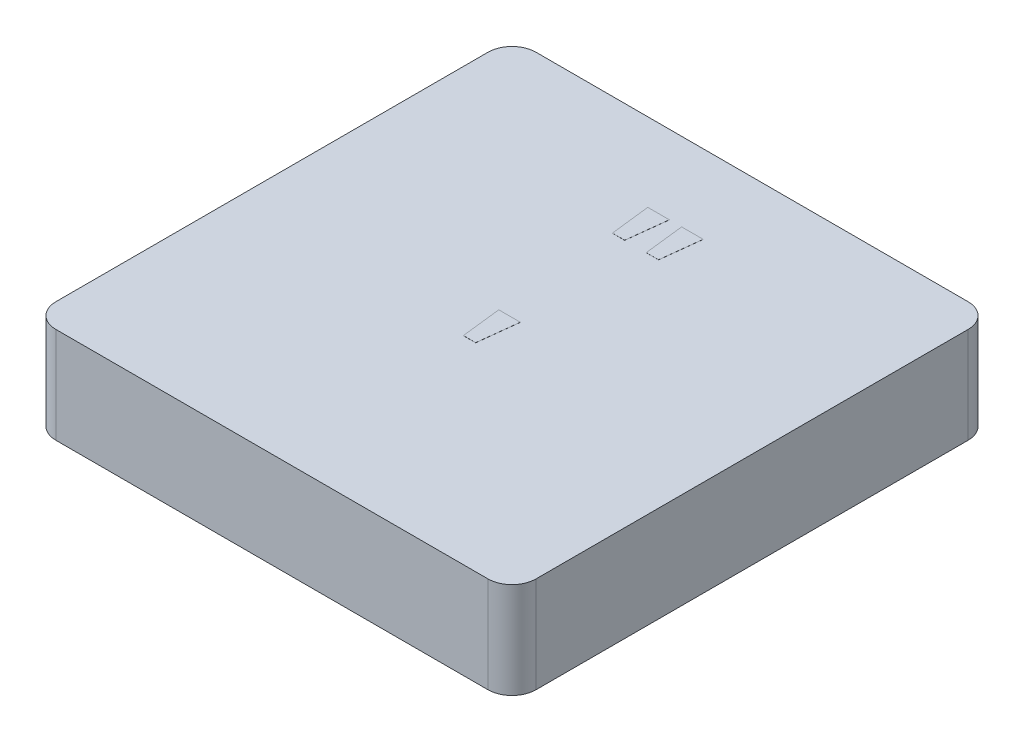
ISO-10303-21;
HEADER;
FILE_DESCRIPTION(('STEP AP214'),'2;1');
FILE_NAME('part.step','',(''),(''),'','','');
FILE_SCHEMA(('AUTOMOTIVE_DESIGN { 1 0 10303 214 1 1 1 1 }'));
ENDSEC;
DATA;
#1=APPLICATION_CONTEXT('core data for automotive mechanical design processes');
#2=APPLICATION_PROTOCOL_DEFINITION('international standard','automotive_design',2000,#1);
#3=PRODUCT_CONTEXT('',#1,'mechanical');
#4=PRODUCT('Part','Part','',(#3));
#5=PRODUCT_RELATED_PRODUCT_CATEGORY('part','',(#4));
#6=PRODUCT_DEFINITION_FORMATION('','',#4);
#7=PRODUCT_DEFINITION_CONTEXT('part definition',#1,'design');
#8=PRODUCT_DEFINITION('design','',#6,#7);
#9=PRODUCT_DEFINITION_SHAPE('','',#8);
#10=(LENGTH_UNIT() NAMED_UNIT(*) SI_UNIT(.MILLI.,.METRE.));
#11=(NAMED_UNIT(*) PLANE_ANGLE_UNIT() SI_UNIT($,.RADIAN.));
#12=(NAMED_UNIT(*) SI_UNIT($,.STERADIAN.) SOLID_ANGLE_UNIT());
#13=UNCERTAINTY_MEASURE_WITH_UNIT(LENGTH_MEASURE(1.E-05),#10,'distance_accuracy_value','');
#14=(GEOMETRIC_REPRESENTATION_CONTEXT(3) GLOBAL_UNCERTAINTY_ASSIGNED_CONTEXT((#13)) GLOBAL_UNIT_ASSIGNED_CONTEXT((#10,
#11,#12)) REPRESENTATION_CONTEXT('',''));
#15=CARTESIAN_POINT('',(0.,0.,0.));
#16=DIRECTION('',(0.,0.,1.));
#17=DIRECTION('',(1.,0.,0.));
#18=AXIS2_PLACEMENT_3D('',#15,#16,#17);
#19=CARTESIAN_POINT('',(0.,2.54,-12.7));
#20=DIRECTION('',(1.,0.,0.));
#21=DIRECTION('',(0.,0.,-1.));
#22=AXIS2_PLACEMENT_3D('',#19,#20,#21);
#23=PLANE('',#22);
#24=DIRECTION('',(0.,0.,1.));
#25=VECTOR('',#24,1.);
#26=CARTESIAN_POINT('',(0.,2.54,-12.7));
#27=LINE('',#26,#25);
#28=CARTESIAN_POINT('',(0.,2.54,-12.065));
#29=VERTEX_POINT('',#28);
#30=CARTESIAN_POINT('',(0.,2.54,-0.635));
#31=VERTEX_POINT('',#30);
#32=EDGE_CURVE('E335',#29,#31,#27,.T.);
#33=ORIENTED_EDGE('',*,*,#32,.F.);
#34=DIRECTION('',(0.,-1.,0.));
#35=VECTOR('',#34,1.);
#36=CARTESIAN_POINT('',(0.,2.54,-12.065));
#37=LINE('',#36,#35);
#38=CARTESIAN_POINT('',(0.,0.,-12.065));
#39=VERTEX_POINT('',#38);
#40=EDGE_CURVE('E360',#29,#39,#37,.T.);
#41=ORIENTED_EDGE('',*,*,#40,.T.);
#42=DIRECTION('',(0.,0.,1.));
#43=VECTOR('',#42,1.);
#44=CARTESIAN_POINT('',(0.,0.,-12.7));
#45=LINE('',#44,#43);
#46=CARTESIAN_POINT('',(0.,0.,-0.635));
#47=VERTEX_POINT('',#46);
#48=EDGE_CURVE('E315',#39,#47,#45,.T.);
#49=ORIENTED_EDGE('',*,*,#48,.T.);
#50=DIRECTION('',(0.,-1.,0.));
#51=VECTOR('',#50,1.);
#52=CARTESIAN_POINT('',(0.,2.54,-0.635));
#53=LINE('',#52,#51);
#54=EDGE_CURVE('E348',#47,#31,#53,.F.);
#55=ORIENTED_EDGE('',*,*,#54,.T.);
#56=EDGE_LOOP('',(#33,#41,#49,#55));
#57=FACE_BOUND('',#56,.T.);
#58=ADVANCED_FACE('F33',(#57),#23,.F.);
#59=CARTESIAN_POINT('',(0.,2.54,0.));
#60=DIRECTION('',(0.,0.,-1.));
#61=DIRECTION('',(-1.,0.,0.));
#62=AXIS2_PLACEMENT_3D('',#59,#60,#61);
#63=PLANE('',#62);
#64=DIRECTION('',(1.,0.,0.));
#65=VECTOR('',#64,1.);
#66=CARTESIAN_POINT('',(0.,0.,0.));
#67=LINE('',#66,#65);
#68=CARTESIAN_POINT('',(0.635,0.,0.));
#69=VERTEX_POINT('',#68);
#70=CARTESIAN_POINT('',(12.065,0.,0.));
#71=VERTEX_POINT('',#70);
#72=EDGE_CURVE('E351',#69,#71,#67,.T.);
#73=ORIENTED_EDGE('',*,*,#72,.T.);
#74=DIRECTION('',(0.,-1.,0.));
#75=VECTOR('',#74,1.);
#76=CARTESIAN_POINT('',(12.065,2.54,0.));
#77=LINE('',#76,#75);
#78=CARTESIAN_POINT('',(12.065,2.54,0.));
#79=VERTEX_POINT('',#78);
#80=EDGE_CURVE('E41',#71,#79,#77,.F.);
#81=ORIENTED_EDGE('',*,*,#80,.T.);
#82=DIRECTION('',(1.,0.,0.));
#83=VECTOR('',#82,1.);
#84=CARTESIAN_POINT('',(0.,2.54,0.));
#85=LINE('',#84,#83);
#86=CARTESIAN_POINT('',(0.635,2.54,0.));
#87=VERTEX_POINT('',#86);
#88=EDGE_CURVE('E338',#87,#79,#85,.T.);
#89=ORIENTED_EDGE('',*,*,#88,.F.);
#90=DIRECTION('',(0.,-1.,0.));
#91=VECTOR('',#90,1.);
#92=CARTESIAN_POINT('',(0.635,2.54,0.));
#93=LINE('',#92,#91);
#94=EDGE_CURVE('E389',#87,#69,#93,.T.);
#95=ORIENTED_EDGE('',*,*,#94,.T.);
#96=EDGE_LOOP('',(#73,#81,#89,#95));
#97=FACE_BOUND('',#96,.T.);
#98=ADVANCED_FACE('F394',(#97),#63,.F.);
#99=CARTESIAN_POINT('',(12.7,2.54,0.));
#100=DIRECTION('',(-1.,0.,0.));
#101=DIRECTION('',(0.,0.,1.));
#102=AXIS2_PLACEMENT_3D('',#99,#100,#101);
#103=PLANE('',#102);
#104=DIRECTION('',(0.,0.,-1.));
#105=VECTOR('',#104,1.);
#106=CARTESIAN_POINT('',(12.7,0.,0.));
#107=LINE('',#106,#105);
#108=CARTESIAN_POINT('',(12.7,0.,-0.635));
#109=VERTEX_POINT('',#108);
#110=CARTESIAN_POINT('',(12.7,0.,-12.065));
#111=VERTEX_POINT('',#110);
#112=EDGE_CURVE('E354',#109,#111,#107,.T.);
#113=ORIENTED_EDGE('',*,*,#112,.T.);
#114=DIRECTION('',(0.,-1.,0.));
#115=VECTOR('',#114,1.);
#116=CARTESIAN_POINT('',(12.7,2.54,-12.065));
#117=LINE('',#116,#115);
#118=CARTESIAN_POINT('',(12.7,2.54,-12.065));
#119=VERTEX_POINT('',#118);
#120=EDGE_CURVE('E387',#111,#119,#117,.F.);
#121=ORIENTED_EDGE('',*,*,#120,.T.);
#122=DIRECTION('',(0.,0.,-1.));
#123=VECTOR('',#122,1.);
#124=CARTESIAN_POINT('',(12.7,2.54,0.));
#125=LINE('',#124,#123);
#126=CARTESIAN_POINT('',(12.7,2.54,-0.635));
#127=VERTEX_POINT('',#126);
#128=EDGE_CURVE('E342',#127,#119,#125,.T.);
#129=ORIENTED_EDGE('',*,*,#128,.F.);
#130=DIRECTION('',(0.,-1.,0.));
#131=VECTOR('',#130,1.);
#132=CARTESIAN_POINT('',(12.7,2.54,-0.635));
#133=LINE('',#132,#131);
#134=EDGE_CURVE('E384',#127,#109,#133,.T.);
#135=ORIENTED_EDGE('',*,*,#134,.T.);
#136=EDGE_LOOP('',(#113,#121,#129,#135));
#137=FACE_BOUND('',#136,.T.);
#138=ADVANCED_FACE('F407',(#137),#103,.F.);
#139=CARTESIAN_POINT('',(12.7,2.54,-12.7));
#140=DIRECTION('',(0.,0.,1.));
#141=DIRECTION('',(1.,0.,0.));
#142=AXIS2_PLACEMENT_3D('',#139,#140,#141);
#143=PLANE('',#142);
#144=DIRECTION('',(-1.,0.,0.));
#145=VECTOR('',#144,1.);
#146=CARTESIAN_POINT('',(12.7,0.,-12.7));
#147=LINE('',#146,#145);
#148=CARTESIAN_POINT('',(12.065,0.,-12.7));
#149=VERTEX_POINT('',#148);
#150=CARTESIAN_POINT('',(0.634999999999995,0.,-12.7));
#151=VERTEX_POINT('',#150);
#152=EDGE_CURVE('E339',#149,#151,#147,.T.);
#153=ORIENTED_EDGE('',*,*,#152,.T.);
#154=DIRECTION('',(0.,-1.,0.));
#155=VECTOR('',#154,1.);
#156=CARTESIAN_POINT('',(0.634999999999995,2.54,-12.7));
#157=LINE('',#156,#155);
#158=CARTESIAN_POINT('',(0.634999999999995,2.54,-12.7));
#159=VERTEX_POINT('',#158);
#160=EDGE_CURVE('E374',#151,#159,#157,.F.);
#161=ORIENTED_EDGE('',*,*,#160,.T.);
#162=DIRECTION('',(-1.,0.,0.));
#163=VECTOR('',#162,1.);
#164=CARTESIAN_POINT('',(12.7,2.54,-12.7));
#165=LINE('',#164,#163);
#166=CARTESIAN_POINT('',(12.065,2.54,-12.7));
#167=VERTEX_POINT('',#166);
#168=EDGE_CURVE('E345',#167,#159,#165,.T.);
#169=ORIENTED_EDGE('',*,*,#168,.F.);
#170=DIRECTION('',(0.,-1.,0.));
#171=VECTOR('',#170,1.);
#172=CARTESIAN_POINT('',(12.065,2.54,-12.7));
#173=LINE('',#172,#171);
#174=EDGE_CURVE('E371',#167,#149,#173,.T.);
#175=ORIENTED_EDGE('',*,*,#174,.T.);
#176=EDGE_LOOP('',(#153,#161,#169,#175));
#177=FACE_BOUND('',#176,.T.);
#178=ADVANCED_FACE('F419',(#177),#143,.F.);
#179=CARTESIAN_POINT('',(0.,2.54,0.));
#180=DIRECTION('',(0.,1.,0.));
#181=DIRECTION('',(0.,0.,1.));
#182=AXIS2_PLACEMENT_3D('',#179,#180,#181);
#183=PLANE('',#182);
#184=DIRECTION('',(-0.114624107985131,0.,0.993408935871131));
#185=VECTOR('',#184,1.);
#186=CARTESIAN_POINT('',(6.61539743589743,2.54,-6.30441025641026));
#187=LINE('',#186,#185);
#188=CARTESIAN_POINT('',(6.61539743589743,2.54,-6.30441025641026));
#189=VERTEX_POINT('',#188);
#190=CARTESIAN_POINT('',(6.49328205128205,2.54,-5.24607692307692));
#191=VERTEX_POINT('',#190);
#192=EDGE_CURVE('E223',#189,#191,#187,.T.);
#193=ORIENTED_EDGE('',*,*,#192,.T.);
#194=DIRECTION('',(-1.,0.,0.));
#195=VECTOR('',#194,1.);
#196=CARTESIAN_POINT('',(6.49328205128205,2.54,-5.24607692307692));
#197=LINE('',#196,#195);
#198=CARTESIAN_POINT('',(6.16764102564102,2.54,-5.24607692307692));
#199=VERTEX_POINT('',#198);
#200=EDGE_CURVE('E199',#191,#199,#197,.T.);
#201=ORIENTED_EDGE('',*,*,#200,.T.);
#202=DIRECTION('',(-0.114624107985131,0.,-0.993408935871131));
#203=VECTOR('',#202,1.);
#204=CARTESIAN_POINT('',(6.16764102564102,2.54,-5.24607692307692));
#205=LINE('',#204,#203);
#206=CARTESIAN_POINT('',(6.04552564102564,2.54,-6.30441025641026));
#207=VERTEX_POINT('',#206);
#208=EDGE_CURVE('E53',#199,#207,#205,.T.);
#209=ORIENTED_EDGE('',*,*,#208,.T.);
#210=DIRECTION('',(1.,0.,0.));
#211=VECTOR('',#210,1.);
#212=CARTESIAN_POINT('',(6.04552564102564,2.54,-6.30441025641026));
#213=LINE('',#212,#211);
#214=EDGE_CURVE('E48',#207,#189,#213,.T.);
#215=ORIENTED_EDGE('',*,*,#214,.T.);
#216=EDGE_LOOP('',(#193,#201,#209,#215));
#217=FACE_BOUND('',#216,.T.);
#218=DIRECTION('',(-0.114624107985131,0.,0.993408935871131));
#219=VECTOR('',#218,1.);
#220=CARTESIAN_POINT('',(6.23928205128205,2.54,-10.6224102564103));
#221=LINE('',#220,#219);
#222=CARTESIAN_POINT('',(6.23928205128205,2.54,-10.6224102564103));
#223=VERTEX_POINT('',#222);
#224=CARTESIAN_POINT('',(6.11716666666666,2.54,-9.56407692307692));
#225=VERTEX_POINT('',#224);
#226=EDGE_CURVE('E228',#223,#225,#221,.T.);
#227=ORIENTED_EDGE('',*,*,#226,.T.);
#228=DIRECTION('',(-1.,0.,0.));
#229=VECTOR('',#228,1.);
#230=CARTESIAN_POINT('',(6.11716666666666,2.54,-9.56407692307692));
#231=LINE('',#230,#229);
#232=CARTESIAN_POINT('',(5.79152564102564,2.54,-9.56407692307692));
#233=VERTEX_POINT('',#232);
#234=EDGE_CURVE('E247',#225,#233,#231,.T.);
#235=ORIENTED_EDGE('',*,*,#234,.T.);
#236=DIRECTION('',(-0.114624107985131,0.,-0.993408935871131));
#237=VECTOR('',#236,1.);
#238=CARTESIAN_POINT('',(5.79152564102564,2.54,-9.56407692307692));
#239=LINE('',#238,#237);
#240=CARTESIAN_POINT('',(5.66941025641025,2.54,-10.6224102564103));
#241=VERTEX_POINT('',#240);
#242=EDGE_CURVE('E249',#233,#241,#239,.T.);
#243=ORIENTED_EDGE('',*,*,#242,.T.);
#244=DIRECTION('',(1.,0.,0.));
#245=VECTOR('',#244,1.);
#246=CARTESIAN_POINT('',(5.66941025641025,2.54,-10.6224102564103));
#247=LINE('',#246,#245);
#248=EDGE_CURVE('E236',#241,#223,#247,.T.);
#249=ORIENTED_EDGE('',*,*,#248,.T.);
#250=EDGE_LOOP('',(#227,#235,#243,#249));
#251=FACE_BOUND('',#250,.T.);
#252=DIRECTION('',(-0.114624107985131,0.,0.993408935871131));
#253=VECTOR('',#252,1.);
#254=CARTESIAN_POINT('',(7.13479487179487,2.54,-10.6224102564103));
#255=LINE('',#254,#253);
#256=CARTESIAN_POINT('',(7.13479487179487,2.54,-10.6224102564103));
#257=VERTEX_POINT('',#256);
#258=CARTESIAN_POINT('',(7.01267948717948,2.54,-9.56407692307692));
#259=VERTEX_POINT('',#258);
#260=EDGE_CURVE('E255',#257,#259,#255,.T.);
#261=ORIENTED_EDGE('',*,*,#260,.T.);
#262=DIRECTION('',(-1.,0.,0.));
#263=VECTOR('',#262,1.);
#264=CARTESIAN_POINT('',(7.01267948717948,2.54,-9.56407692307692));
#265=LINE('',#264,#263);
#266=CARTESIAN_POINT('',(6.68703846153846,2.54,-9.56407692307692));
#267=VERTEX_POINT('',#266);
#268=EDGE_CURVE('E279',#259,#267,#265,.T.);
#269=ORIENTED_EDGE('',*,*,#268,.T.);
#270=DIRECTION('',(-0.11462410798513,0.,-0.993408935871131));
#271=VECTOR('',#270,1.);
#272=CARTESIAN_POINT('',(6.68703846153846,2.54,-9.56407692307692));
#273=LINE('',#272,#271);
#274=CARTESIAN_POINT('',(6.56492307692307,2.54,-10.6224102564103));
#275=VERTEX_POINT('',#274);
#276=EDGE_CURVE('E281',#267,#275,#273,.T.);
#277=ORIENTED_EDGE('',*,*,#276,.T.);
#278=DIRECTION('',(1.,0.,0.));
#279=VECTOR('',#278,1.);
#280=CARTESIAN_POINT('',(6.56492307692307,2.54,-10.6224102564103));
#281=LINE('',#280,#279);
#282=EDGE_CURVE('E268',#275,#257,#281,.T.);
#283=ORIENTED_EDGE('',*,*,#282,.T.);
#284=EDGE_LOOP('',(#261,#269,#277,#283));
#285=FACE_BOUND('',#284,.T.);
#286=ORIENTED_EDGE('',*,*,#168,.T.);
#287=CARTESIAN_POINT('',(0.634999999999995,2.54,-12.065));
#288=DIRECTION('',(0.,1.,0.));
#289=DIRECTION('',(0.,0.,1.));
#290=AXIS2_PLACEMENT_3D('',#287,#288,#289);
#291=CIRCLE('',#290,0.635);
#292=EDGE_CURVE('E382',#159,#29,#291,.T.);
#293=ORIENTED_EDGE('',*,*,#292,.T.);
#294=ORIENTED_EDGE('',*,*,#32,.T.);
#295=CARTESIAN_POINT('',(0.635,2.54,-0.635));
#296=DIRECTION('',(0.,1.,0.));
#297=DIRECTION('',(0.,0.,1.));
#298=AXIS2_PLACEMENT_3D('',#295,#296,#297);
#299=CIRCLE('',#298,0.635);
#300=EDGE_CURVE('E376',#31,#87,#299,.T.);
#301=ORIENTED_EDGE('',*,*,#300,.T.);
#302=ORIENTED_EDGE('',*,*,#88,.T.);
#303=CARTESIAN_POINT('',(12.065,2.54,-0.635));
#304=DIRECTION('',(0.,1.,0.));
#305=DIRECTION('',(0.,0.,1.));
#306=AXIS2_PLACEMENT_3D('',#303,#304,#305);
#307=CIRCLE('',#306,0.635);
#308=EDGE_CURVE('E378',#79,#127,#307,.T.);
#309=ORIENTED_EDGE('',*,*,#308,.T.);
#310=ORIENTED_EDGE('',*,*,#128,.T.);
#311=CARTESIAN_POINT('',(12.065,2.54,-12.065));
#312=DIRECTION('',(0.,1.,0.));
#313=DIRECTION('',(0.,0.,1.));
#314=AXIS2_PLACEMENT_3D('',#311,#312,#313);
#315=CIRCLE('',#314,0.635);
#316=EDGE_CURVE('E380',#119,#167,#315,.T.);
#317=ORIENTED_EDGE('',*,*,#316,.T.);
#318=EDGE_LOOP('',(#286,#293,#294,#301,#302,#309,#310,#317));
#319=FACE_BOUND('',#318,.T.);
#320=ADVANCED_FACE('F400',(#217,#251,#285,#319),#183,.T.);
#321=CARTESIAN_POINT('',(0.,0.,0.));
#322=DIRECTION('',(0.,1.,0.));
#323=DIRECTION('',(0.,0.,1.));
#324=AXIS2_PLACEMENT_3D('',#321,#322,#323);
#325=PLANE('',#324);
#326=DIRECTION('',(-1.,0.,0.));
#327=VECTOR('',#326,1.);
#328=CARTESIAN_POINT('',(12.7,0.,-12.065));
#329=LINE('',#328,#327);
#330=CARTESIAN_POINT('',(12.065,0.,-12.065));
#331=VERTEX_POINT('',#330);
#332=CARTESIAN_POINT('',(0.634999999999995,0.,-12.065));
#333=VERTEX_POINT('',#332);
#334=EDGE_CURVE('E303',#331,#333,#329,.T.);
#335=ORIENTED_EDGE('',*,*,#334,.T.);
#336=DIRECTION('',(0.,0.,1.));
#337=VECTOR('',#336,1.);
#338=CARTESIAN_POINT('',(0.634999999999995,0.,-12.7));
#339=LINE('',#338,#337);
#340=CARTESIAN_POINT('',(0.635,0.,-0.635));
#341=VERTEX_POINT('',#340);
#342=EDGE_CURVE('E298',#333,#341,#339,.T.);
#343=ORIENTED_EDGE('',*,*,#342,.T.);
#344=DIRECTION('',(1.,0.,0.));
#345=VECTOR('',#344,1.);
#346=CARTESIAN_POINT('',(0.,0.,-0.635));
#347=LINE('',#346,#345);
#348=CARTESIAN_POINT('',(12.065,0.,-0.635));
#349=VERTEX_POINT('',#348);
#350=EDGE_CURVE('E327',#341,#349,#347,.T.);
#351=ORIENTED_EDGE('',*,*,#350,.T.);
#352=DIRECTION('',(0.,0.,-1.));
#353=VECTOR('',#352,1.);
#354=CARTESIAN_POINT('',(12.065,0.,0.));
#355=LINE('',#354,#353);
#356=EDGE_CURVE('E330',#349,#331,#355,.T.);
#357=ORIENTED_EDGE('',*,*,#356,.T.);
#358=EDGE_LOOP('',(#335,#343,#351,#357));
#359=FACE_BOUND('',#358,.T.);
#360=ORIENTED_EDGE('',*,*,#48,.F.);
#361=CARTESIAN_POINT('',(0.634999999999995,0.,-12.065));
#362=DIRECTION('',(0.,1.,0.));
#363=DIRECTION('',(0.,0.,1.));
#364=AXIS2_PLACEMENT_3D('',#361,#362,#363);
#365=CIRCLE('',#364,0.635);
#366=EDGE_CURVE('E369',#39,#151,#365,.F.);
#367=ORIENTED_EDGE('',*,*,#366,.T.);
#368=ORIENTED_EDGE('',*,*,#152,.F.);
#369=CARTESIAN_POINT('',(12.065,0.,-12.065));
#370=DIRECTION('',(0.,1.,0.));
#371=DIRECTION('',(0.,0.,1.));
#372=AXIS2_PLACEMENT_3D('',#369,#370,#371);
#373=CIRCLE('',#372,0.635);
#374=EDGE_CURVE('E367',#149,#111,#373,.F.);
#375=ORIENTED_EDGE('',*,*,#374,.T.);
#376=ORIENTED_EDGE('',*,*,#112,.F.);
#377=CARTESIAN_POINT('',(12.065,0.,-0.635));
#378=DIRECTION('',(0.,1.,0.));
#379=DIRECTION('',(0.,0.,1.));
#380=AXIS2_PLACEMENT_3D('',#377,#378,#379);
#381=CIRCLE('',#380,0.635);
#382=EDGE_CURVE('E365',#109,#71,#381,.F.);
#383=ORIENTED_EDGE('',*,*,#382,.T.);
#384=ORIENTED_EDGE('',*,*,#72,.F.);
#385=CARTESIAN_POINT('',(0.635,0.,-0.635));
#386=DIRECTION('',(0.,1.,0.));
#387=DIRECTION('',(0.,0.,1.));
#388=AXIS2_PLACEMENT_3D('',#385,#386,#387);
#389=CIRCLE('',#388,0.635);
#390=EDGE_CURVE('E363',#69,#47,#389,.F.);
#391=ORIENTED_EDGE('',*,*,#390,.T.);
#392=EDGE_LOOP('',(#360,#367,#368,#375,#376,#383,#384,#391));
#393=FACE_BOUND('',#392,.T.);
#394=ADVANCED_FACE('F411',(#359,#393),#325,.F.);
#395=CARTESIAN_POINT('',(0.634999999999995,2.54,-12.065));
#396=DIRECTION('',(0.,-1.,0.));
#397=DIRECTION('',(0.,0.,-1.));
#398=AXIS2_PLACEMENT_3D('',#395,#396,#397);
#399=CYLINDRICAL_SURFACE('',#398,0.635);
#400=ORIENTED_EDGE('',*,*,#292,.F.);
#401=ORIENTED_EDGE('',*,*,#160,.F.);
#402=ORIENTED_EDGE('',*,*,#366,.F.);
#403=ORIENTED_EDGE('',*,*,#40,.F.);
#404=EDGE_LOOP('',(#400,#401,#402,#403));
#405=FACE_BOUND('',#404,.T.);
#406=ADVANCED_FACE('F425',(#405),#399,.T.);
#407=CARTESIAN_POINT('',(12.065,2.54,-12.065));
#408=DIRECTION('',(0.,-1.,0.));
#409=DIRECTION('',(0.,0.,-1.));
#410=AXIS2_PLACEMENT_3D('',#407,#408,#409);
#411=CYLINDRICAL_SURFACE('',#410,0.635);
#412=ORIENTED_EDGE('',*,*,#316,.F.);
#413=ORIENTED_EDGE('',*,*,#120,.F.);
#414=ORIENTED_EDGE('',*,*,#374,.F.);
#415=ORIENTED_EDGE('',*,*,#174,.F.);
#416=EDGE_LOOP('',(#412,#413,#414,#415));
#417=FACE_BOUND('',#416,.T.);
#418=ADVANCED_FACE('F416',(#417),#411,.T.);
#419=CARTESIAN_POINT('',(12.065,2.54,-0.635));
#420=DIRECTION('',(0.,-1.,0.));
#421=DIRECTION('',(0.,0.,-1.));
#422=AXIS2_PLACEMENT_3D('',#419,#420,#421);
#423=CYLINDRICAL_SURFACE('',#422,0.635);
#424=ORIENTED_EDGE('',*,*,#308,.F.);
#425=ORIENTED_EDGE('',*,*,#80,.F.);
#426=ORIENTED_EDGE('',*,*,#382,.F.);
#427=ORIENTED_EDGE('',*,*,#134,.F.);
#428=EDGE_LOOP('',(#424,#425,#426,#427));
#429=FACE_BOUND('',#428,.T.);
#430=ADVANCED_FACE('F404',(#429),#423,.T.);
#431=CARTESIAN_POINT('',(0.635,2.54,-0.635));
#432=DIRECTION('',(0.,-1.,0.));
#433=DIRECTION('',(0.,0.,-1.));
#434=AXIS2_PLACEMENT_3D('',#431,#432,#433);
#435=CYLINDRICAL_SURFACE('',#434,0.635);
#436=ORIENTED_EDGE('',*,*,#300,.F.);
#437=ORIENTED_EDGE('',*,*,#54,.F.);
#438=ORIENTED_EDGE('',*,*,#390,.F.);
#439=ORIENTED_EDGE('',*,*,#94,.F.);
#440=EDGE_LOOP('',(#436,#437,#438,#439));
#441=FACE_BOUND('',#440,.T.);
#442=ADVANCED_FACE('F35',(#441),#435,.T.);
#443=CARTESIAN_POINT('',(0.634999999999995,2.54,-12.7));
#444=DIRECTION('',(1.,0.,0.));
#445=DIRECTION('',(0.,0.,-1.));
#446=AXIS2_PLACEMENT_3D('',#443,#444,#445);
#447=PLANE('',#446);
#448=DIRECTION('',(0.,0.,1.));
#449=VECTOR('',#448,1.);
#450=CARTESIAN_POINT('',(0.634999999999995,1.905,-12.7));
#451=LINE('',#450,#449);
#452=CARTESIAN_POINT('',(0.634999999999995,1.905,-12.065));
#453=VERTEX_POINT('',#452);
#454=CARTESIAN_POINT('',(0.635,1.905,-0.635));
#455=VERTEX_POINT('',#454);
#456=EDGE_CURVE('E299',#453,#455,#451,.T.);
#457=ORIENTED_EDGE('',*,*,#456,.T.);
#458=DIRECTION('',(0.,1.,0.));
#459=VECTOR('',#458,1.);
#460=CARTESIAN_POINT('',(0.635,2.54,-0.635));
#461=LINE('',#460,#459);
#462=EDGE_CURVE('E308',#341,#455,#461,.T.);
#463=ORIENTED_EDGE('',*,*,#462,.F.);
#464=ORIENTED_EDGE('',*,*,#342,.F.);
#465=DIRECTION('',(0.,1.,0.));
#466=VECTOR('',#465,1.);
#467=CARTESIAN_POINT('',(0.634999999999995,2.54,-12.065));
#468=LINE('',#467,#466);
#469=EDGE_CURVE('E304',#333,#453,#468,.T.);
#470=ORIENTED_EDGE('',*,*,#469,.T.);
#471=EDGE_LOOP('',(#457,#463,#464,#470));
#472=FACE_BOUND('',#471,.T.);
#473=ADVANCED_FACE('F430',(#472),#447,.T.);
#474=CARTESIAN_POINT('',(0.,2.54,-0.635));
#475=DIRECTION('',(0.,0.,-1.));
#476=DIRECTION('',(-1.,0.,0.));
#477=AXIS2_PLACEMENT_3D('',#474,#475,#476);
#478=PLANE('',#477);
#479=ORIENTED_EDGE('',*,*,#350,.F.);
#480=ORIENTED_EDGE('',*,*,#462,.T.);
#481=DIRECTION('',(1.,0.,0.));
#482=VECTOR('',#481,1.);
#483=CARTESIAN_POINT('',(0.,1.905,-0.635));
#484=LINE('',#483,#482);
#485=CARTESIAN_POINT('',(12.065,1.905,-0.635));
#486=VERTEX_POINT('',#485);
#487=EDGE_CURVE('E302',#455,#486,#484,.T.);
#488=ORIENTED_EDGE('',*,*,#487,.T.);
#489=DIRECTION('',(0.,1.,0.));
#490=VECTOR('',#489,1.);
#491=CARTESIAN_POINT('',(12.065,2.54,-0.635));
#492=LINE('',#491,#490);
#493=EDGE_CURVE('E312',#349,#486,#492,.T.);
#494=ORIENTED_EDGE('',*,*,#493,.F.);
#495=EDGE_LOOP('',(#479,#480,#488,#494));
#496=FACE_BOUND('',#495,.T.);
#497=ADVANCED_FACE('F435',(#496),#478,.T.);
#498=CARTESIAN_POINT('',(12.065,2.54,0.));
#499=DIRECTION('',(-1.,0.,0.));
#500=DIRECTION('',(0.,0.,1.));
#501=AXIS2_PLACEMENT_3D('',#498,#499,#500);
#502=PLANE('',#501);
#503=ORIENTED_EDGE('',*,*,#356,.F.);
#504=ORIENTED_EDGE('',*,*,#493,.T.);
#505=DIRECTION('',(0.,0.,-1.));
#506=VECTOR('',#505,1.);
#507=CARTESIAN_POINT('',(12.065,1.905,0.));
#508=LINE('',#507,#506);
#509=CARTESIAN_POINT('',(12.065,1.905,-12.065));
#510=VERTEX_POINT('',#509);
#511=EDGE_CURVE('E318',#486,#510,#508,.T.);
#512=ORIENTED_EDGE('',*,*,#511,.T.);
#513=DIRECTION('',(0.,1.,0.));
#514=VECTOR('',#513,1.);
#515=CARTESIAN_POINT('',(12.065,2.54,-12.065));
#516=LINE('',#515,#514);
#517=EDGE_CURVE('E307',#331,#510,#516,.T.);
#518=ORIENTED_EDGE('',*,*,#517,.F.);
#519=EDGE_LOOP('',(#503,#504,#512,#518));
#520=FACE_BOUND('',#519,.T.);
#521=ADVANCED_FACE('F488',(#520),#502,.T.);
#522=CARTESIAN_POINT('',(12.7,2.54,-12.065));
#523=DIRECTION('',(0.,0.,1.));
#524=DIRECTION('',(1.,0.,0.));
#525=AXIS2_PLACEMENT_3D('',#522,#523,#524);
#526=PLANE('',#525);
#527=ORIENTED_EDGE('',*,*,#334,.F.);
#528=ORIENTED_EDGE('',*,*,#517,.T.);
#529=DIRECTION('',(-1.,0.,0.));
#530=VECTOR('',#529,1.);
#531=CARTESIAN_POINT('',(12.7,1.905,-12.065));
#532=LINE('',#531,#530);
#533=EDGE_CURVE('E311',#510,#453,#532,.T.);
#534=ORIENTED_EDGE('',*,*,#533,.T.);
#535=ORIENTED_EDGE('',*,*,#469,.F.);
#536=EDGE_LOOP('',(#527,#528,#534,#535));
#537=FACE_BOUND('',#536,.T.);
#538=ADVANCED_FACE('F498',(#537),#526,.T.);
#539=CARTESIAN_POINT('',(0.,1.905,0.));
#540=DIRECTION('',(0.,1.,0.));
#541=DIRECTION('',(0.,0.,1.));
#542=AXIS2_PLACEMENT_3D('',#539,#540,#541);
#543=PLANE('',#542);
#544=CARTESIAN_POINT('',(6.34999999999999,1.905,-6.35));
#545=DIRECTION('',(0.,1.,0.));
#546=DIRECTION('',(0.,0.,1.));
#547=AXIS2_PLACEMENT_3D('',#544,#545,#546);
#548=CIRCLE('',#547,2.54);
#549=CARTESIAN_POINT('',(6.34999999999999,1.905,-3.81));
#550=VERTEX_POINT('',#549);
#551=EDGE_CURVE('E11',#550,#550,#548,.F.);
#552=ORIENTED_EDGE('',*,*,#551,.F.);
#553=EDGE_LOOP('',(#552));
#554=FACE_BOUND('',#553,.T.);
#555=ORIENTED_EDGE('',*,*,#533,.F.);
#556=ORIENTED_EDGE('',*,*,#511,.F.);
#557=ORIENTED_EDGE('',*,*,#487,.F.);
#558=ORIENTED_EDGE('',*,*,#456,.F.);
#559=EDGE_LOOP('',(#555,#556,#557,#558));
#560=FACE_BOUND('',#559,.T.);
#561=ADVANCED_FACE('F508',(#554,#560),#543,.F.);
#562=CARTESIAN_POINT('',(6.34999999999999,-7.18420489685532,-6.35));
#563=DIRECTION('',(0.,1.,0.));
#564=DIRECTION('',(0.,0.,1.));
#565=AXIS2_PLACEMENT_3D('',#562,#563,#564);
#566=CYLINDRICAL_SURFACE('',#565,2.54);
#567=CARTESIAN_POINT('',(6.34999999999999,0.,-6.35));
#568=DIRECTION('',(0.,1.,0.));
#569=DIRECTION('',(0.,0.,1.));
#570=AXIS2_PLACEMENT_3D('',#567,#568,#569);
#571=CIRCLE('',#570,2.54);
#572=CARTESIAN_POINT('',(6.34999999999999,0.,-3.81));
#573=VERTEX_POINT('',#572);
#574=EDGE_CURVE('E287',#573,#573,#571,.T.);
#575=CARTESIAN_POINT('',(6.34999999999999,0.,-3.81));
#576=CARTESIAN_POINT('',(6.34999999999999,0.0198437499999991,-3.81));
#577=CARTESIAN_POINT('',(6.34999999999999,0.0396874999999989,-3.81));
#578=CARTESIAN_POINT('',(6.34999999999999,0.079374999999999,-3.81));
#579=CARTESIAN_POINT('',(6.34999999999999,0.0992187499999992,-3.81));
#580=CARTESIAN_POINT('',(6.34999999999999,0.138906249999999,-3.81));
#581=CARTESIAN_POINT('',(6.34999999999999,0.158749999999999,-3.81));
#582=CARTESIAN_POINT('',(6.34999999999999,0.198437499999999,-3.81));
#583=CARTESIAN_POINT('',(6.34999999999999,0.218281249999999,-3.81));
#584=CARTESIAN_POINT('',(6.34999999999999,0.25796875,-3.81));
#585=CARTESIAN_POINT('',(6.34999999999999,0.277812499999999,-3.81));
#586=CARTESIAN_POINT('',(6.34999999999999,0.317499999999999,-3.81));
#587=CARTESIAN_POINT('',(6.34999999999999,0.337343749999999,-3.81));
#588=CARTESIAN_POINT('',(6.34999999999999,0.377031249999999,-3.81));
#589=CARTESIAN_POINT('',(6.34999999999999,0.396874999999999,-3.81));
#590=CARTESIAN_POINT('',(6.34999999999999,0.436562499999999,-3.81));
#591=CARTESIAN_POINT('',(6.34999999999999,0.456406249999999,-3.81));
#592=CARTESIAN_POINT('',(6.34999999999999,0.496093749999999,-3.81));
#593=CARTESIAN_POINT('',(6.34999999999999,0.515937499999999,-3.81));
#594=CARTESIAN_POINT('',(6.34999999999999,0.555624999999999,-3.81));
#595=CARTESIAN_POINT('',(6.34999999999999,0.575468749999999,-3.81));
#596=CARTESIAN_POINT('',(6.34999999999999,0.615156249999999,-3.81));
#597=CARTESIAN_POINT('',(6.34999999999999,0.634999999999999,-3.81));
#598=CARTESIAN_POINT('',(6.34999999999999,0.674687499999998,-3.81));
#599=CARTESIAN_POINT('',(6.34999999999999,0.694531249999998,-3.81));
#600=CARTESIAN_POINT('',(6.34999999999999,0.734218749999998,-3.81));
#601=CARTESIAN_POINT('',(6.34999999999999,0.754062499999998,-3.81));
#602=CARTESIAN_POINT('',(6.34999999999999,0.793749999999998,-3.81));
#603=CARTESIAN_POINT('',(6.34999999999999,0.813593749999999,-3.81));
#604=CARTESIAN_POINT('',(6.34999999999999,0.853281249999999,-3.81));
#605=CARTESIAN_POINT('',(6.34999999999999,0.873124999999999,-3.81));
#606=CARTESIAN_POINT('',(6.34999999999999,0.912812499999999,-3.81));
#607=CARTESIAN_POINT('',(6.34999999999999,0.932656249999999,-3.81));
#608=CARTESIAN_POINT('',(6.34999999999999,0.972343749999998,-3.81));
#609=CARTESIAN_POINT('',(6.34999999999999,0.992187499999998,-3.81));
#610=CARTESIAN_POINT('',(6.34999999999999,1.031875,-3.81));
#611=CARTESIAN_POINT('',(6.34999999999999,1.05171875,-3.81));
#612=CARTESIAN_POINT('',(6.34999999999999,1.09140625,-3.81));
#613=CARTESIAN_POINT('',(6.34999999999999,1.11125,-3.81));
#614=CARTESIAN_POINT('',(6.34999999999999,1.1509375,-3.81));
#615=CARTESIAN_POINT('',(6.34999999999999,1.17078125,-3.81));
#616=CARTESIAN_POINT('',(6.34999999999999,1.21046875,-3.81));
#617=CARTESIAN_POINT('',(6.34999999999999,1.2303125,-3.81));
#618=CARTESIAN_POINT('',(6.34999999999999,1.27,-3.81));
#619=CARTESIAN_POINT('',(6.34999999999999,1.28984375,-3.81));
#620=CARTESIAN_POINT('',(6.34999999999999,1.32953125,-3.81));
#621=CARTESIAN_POINT('',(6.34999999999999,1.349375,-3.81));
#622=CARTESIAN_POINT('',(6.34999999999999,1.3890625,-3.81));
#623=CARTESIAN_POINT('',(6.34999999999999,1.40890625,-3.81));
#624=CARTESIAN_POINT('',(6.34999999999999,1.44859375,-3.81));
#625=CARTESIAN_POINT('',(6.34999999999999,1.4684375,-3.81));
#626=CARTESIAN_POINT('',(6.34999999999999,1.508125,-3.81));
#627=CARTESIAN_POINT('',(6.34999999999999,1.52796875,-3.81));
#628=CARTESIAN_POINT('',(6.34999999999999,1.56765625,-3.81));
#629=CARTESIAN_POINT('',(6.34999999999999,1.5875,-3.81));
#630=CARTESIAN_POINT('',(6.34999999999999,1.6271875,-3.81));
#631=CARTESIAN_POINT('',(6.34999999999999,1.64703125,-3.81));
#632=CARTESIAN_POINT('',(6.34999999999999,1.68671875,-3.81));
#633=CARTESIAN_POINT('',(6.34999999999999,1.7065625,-3.81));
#634=CARTESIAN_POINT('',(6.34999999999999,1.74625,-3.81));
#635=CARTESIAN_POINT('',(6.34999999999999,1.76609375,-3.81));
#636=CARTESIAN_POINT('',(6.34999999999999,1.80578125,-3.81));
#637=CARTESIAN_POINT('',(6.34999999999999,1.825625,-3.81));
#638=CARTESIAN_POINT('',(6.34999999999999,1.8653125,-3.81));
#639=CARTESIAN_POINT('',(6.34999999999999,1.88515625,-3.81));
#640=CARTESIAN_POINT('',(6.34999999999999,1.905,-3.81));
#641=B_SPLINE_CURVE_WITH_KNOTS('',3,(#575,#576,#577,#578,#579,#580,#581,#582,#583,#584,#585,
#586,#587,#588,#589,#590,#591,#592,#593,#594,#595,#596,#597,#598,#599,#600,#601,#602,#603,#604,
#605,#606,#607,#608,#609,#610,#611,#612,#613,#614,#615,#616,#617,#618,#619,#620,#621,#622,#623,
#624,#625,#626,#627,#628,#629,#630,#631,#632,#633,#634,#635,#636,#637,#638,#639,#640),
.UNSPECIFIED.,.F.,.F.,(4,2,2,2,2,2,2,2,2,2,2,2,2,2,2,2,2,2,2,2,2,2,2,2,2,2,2,2,2,2,2,2,4),(0.,
0.0595312499999997,0.1190625,0.17859375,0.238125,0.29765625,0.3571875,0.41671875,0.47625,
0.53578125,0.5953125,0.654843749999999,0.714374999999999,0.773906249999999,0.8334375,0.89296875,
0.952499999999999,1.01203125,1.0715625,1.13109375,1.190625,1.25015625,1.3096875,1.36921875,
1.42875,1.48828125,1.5478125,1.60734375,1.666875,1.72640625,1.7859375,1.84546875,1.905),.UNSPECIFIED.);
#642=EDGE_CURVE('BSEAM518',#573,#550,#641,.T.);
#643=ORIENTED_EDGE('',*,*,#574,.T.);
#644=ORIENTED_EDGE('',*,*,#551,.T.);
#645=ORIENTED_EDGE('',*,*,#642,.T.);
#646=ORIENTED_EDGE('',*,*,#642,.F.);
#647=EDGE_LOOP('',(#643,#645,#644,#646));
#648=FACE_BOUND('',#647,.T.);
#649=ADVANCED_FACE('F518',(#648),#566,.T.);
#650=CARTESIAN_POINT('',(0.,0.,0.));
#651=DIRECTION('',(0.,1.,0.));
#652=DIRECTION('',(0.,0.,1.));
#653=AXIS2_PLACEMENT_3D('',#650,#651,#652);
#654=PLANE('',#653);
#655=ORIENTED_EDGE('',*,*,#574,.F.);
#656=EDGE_LOOP('',(#655));
#657=FACE_BOUND('',#656,.T.);
#658=ADVANCED_FACE('F528',(#657),#654,.F.);
#659=CARTESIAN_POINT('',(7.13479487179487,2.54254,-10.6224102564103));
#660=DIRECTION('',(0.993408935871131,0.,0.114624107985131));
#661=DIRECTION('',(0.114624107985131,0.,-0.993408935871131));
#662=AXIS2_PLACEMENT_3D('',#659,#660,#661);
#663=PLANE('',#662);
#664=ORIENTED_EDGE('',*,*,#260,.F.);
#665=DIRECTION('',(0.,-1.,0.));
#666=VECTOR('',#665,1.);
#667=CARTESIAN_POINT('',(7.13479487179487,2.54254,-10.6224102564103));
#668=LINE('',#667,#666);
#669=CARTESIAN_POINT('',(7.13479487179487,2.54254,-10.6224102564103));
#670=VERTEX_POINT('',#669);
#671=EDGE_CURVE('E284',#670,#257,#668,.T.);
#672=ORIENTED_EDGE('',*,*,#671,.F.);
#673=DIRECTION('',(-0.114624107985131,0.,0.993408935871131));
#674=VECTOR('',#673,1.);
#675=CARTESIAN_POINT('',(7.13479487179487,2.54254,-10.6224102564103));
#676=LINE('',#675,#674);
#677=CARTESIAN_POINT('',(7.01267948717948,2.54254,-9.56407692307692));
#678=VERTEX_POINT('',#677);
#679=EDGE_CURVE('E264',#670,#678,#676,.T.);
#680=ORIENTED_EDGE('',*,*,#679,.T.);
#681=DIRECTION('',(0.,-1.,0.));
#682=VECTOR('',#681,1.);
#683=CARTESIAN_POINT('',(7.01267948717948,2.54254,-9.56407692307692));
#684=LINE('',#683,#682);
#685=EDGE_CURVE('E277',#678,#259,#684,.T.);
#686=ORIENTED_EDGE('',*,*,#685,.T.);
#687=EDGE_LOOP('',(#664,#672,#680,#686));
#688=FACE_BOUND('',#687,.T.);
#689=ADVANCED_FACE('F538',(#688),#663,.T.);
#690=CARTESIAN_POINT('',(6.56492307692307,2.54254,-10.6224102564103));
#691=DIRECTION('',(0.,0.,-1.));
#692=DIRECTION('',(-1.,0.,0.));
#693=AXIS2_PLACEMENT_3D('',#690,#691,#692);
#694=PLANE('',#693);
#695=ORIENTED_EDGE('',*,*,#282,.F.);
#696=DIRECTION('',(0.,-1.,0.));
#697=VECTOR('',#696,1.);
#698=CARTESIAN_POINT('',(6.56492307692307,2.54254,-10.6224102564103));
#699=LINE('',#698,#697);
#700=CARTESIAN_POINT('',(6.56492307692307,2.54254,-10.6224102564103));
#701=VERTEX_POINT('',#700);
#702=EDGE_CURVE('E288',#701,#275,#699,.T.);
#703=ORIENTED_EDGE('',*,*,#702,.F.);
#704=DIRECTION('',(1.,0.,0.));
#705=VECTOR('',#704,1.);
#706=CARTESIAN_POINT('',(6.56492307692307,2.54254,-10.6224102564103));
#707=LINE('',#706,#705);
#708=EDGE_CURVE('E274',#701,#670,#707,.T.);
#709=ORIENTED_EDGE('',*,*,#708,.T.);
#710=ORIENTED_EDGE('',*,*,#671,.T.);
#711=EDGE_LOOP('',(#695,#703,#709,#710));
#712=FACE_BOUND('',#711,.T.);
#713=ADVANCED_FACE('F556',(#712),#694,.T.);
#714=CARTESIAN_POINT('',(6.68703846153846,2.54254,-9.56407692307692));
#715=DIRECTION('',(-0.993408935871131,0.,0.11462410798513));
#716=DIRECTION('',(0.11462410798513,0.,0.993408935871131));
#717=AXIS2_PLACEMENT_3D('',#714,#715,#716);
#718=PLANE('',#717);
#719=ORIENTED_EDGE('',*,*,#276,.F.);
#720=DIRECTION('',(0.,-1.,0.));
#721=VECTOR('',#720,1.);
#722=CARTESIAN_POINT('',(6.68703846153846,2.54254,-9.56407692307692));
#723=LINE('',#722,#721);
#724=CARTESIAN_POINT('',(6.68703846153846,2.54254,-9.56407692307692));
#725=VERTEX_POINT('',#724);
#726=EDGE_CURVE('E291',#725,#267,#723,.T.);
#727=ORIENTED_EDGE('',*,*,#726,.F.);
#728=DIRECTION('',(-0.11462410798513,0.,-0.993408935871131));
#729=VECTOR('',#728,1.);
#730=CARTESIAN_POINT('',(6.68703846153846,2.54254,-9.56407692307692));
#731=LINE('',#730,#729);
#732=EDGE_CURVE('E271',#725,#701,#731,.T.);
#733=ORIENTED_EDGE('',*,*,#732,.T.);
#734=ORIENTED_EDGE('',*,*,#702,.T.);
#735=EDGE_LOOP('',(#719,#727,#733,#734));
#736=FACE_BOUND('',#735,.T.);
#737=ADVANCED_FACE('F566',(#736),#718,.T.);
#738=CARTESIAN_POINT('',(7.01267948717948,2.54254,-9.56407692307692));
#739=DIRECTION('',(0.,0.,1.));
#740=DIRECTION('',(1.,0.,0.));
#741=AXIS2_PLACEMENT_3D('',#738,#739,#740);
#742=PLANE('',#741);
#743=ORIENTED_EDGE('',*,*,#268,.F.);
#744=ORIENTED_EDGE('',*,*,#685,.F.);
#745=DIRECTION('',(-1.,0.,0.));
#746=VECTOR('',#745,1.);
#747=CARTESIAN_POINT('',(7.01267948717948,2.54254,-9.56407692307692));
#748=LINE('',#747,#746);
#749=EDGE_CURVE('E267',#678,#725,#748,.T.);
#750=ORIENTED_EDGE('',*,*,#749,.T.);
#751=ORIENTED_EDGE('',*,*,#726,.T.);
#752=EDGE_LOOP('',(#743,#744,#750,#751));
#753=FACE_BOUND('',#752,.T.);
#754=ADVANCED_FACE('F576',(#753),#742,.T.);
#755=CARTESIAN_POINT('',(0.,2.54254,0.));
#756=DIRECTION('',(0.,-1.,0.));
#757=DIRECTION('',(0.,0.,-1.));
#758=AXIS2_PLACEMENT_3D('',#755,#756,#757);
#759=PLANE('',#758);
#760=ORIENTED_EDGE('',*,*,#679,.F.);
#761=ORIENTED_EDGE('',*,*,#708,.F.);
#762=ORIENTED_EDGE('',*,*,#732,.F.);
#763=ORIENTED_EDGE('',*,*,#749,.F.);
#764=EDGE_LOOP('',(#760,#761,#762,#763));
#765=FACE_BOUND('',#764,.T.);
#766=ADVANCED_FACE('F586',(#765),#759,.F.);
#767=CARTESIAN_POINT('',(6.23928205128205,2.54254,-10.6224102564103));
#768=DIRECTION('',(0.993408935871131,0.,0.114624107985131));
#769=DIRECTION('',(0.114624107985131,0.,-0.993408935871131));
#770=AXIS2_PLACEMENT_3D('',#767,#768,#769);
#771=PLANE('',#770);
#772=ORIENTED_EDGE('',*,*,#226,.F.);
#773=DIRECTION('',(0.,-1.,0.));
#774=VECTOR('',#773,1.);
#775=CARTESIAN_POINT('',(6.23928205128205,2.54254,-10.6224102564103));
#776=LINE('',#775,#774);
#777=CARTESIAN_POINT('',(6.23928205128205,2.54254,-10.6224102564103));
#778=VERTEX_POINT('',#777);
#779=EDGE_CURVE('E252',#778,#223,#776,.T.);
#780=ORIENTED_EDGE('',*,*,#779,.F.);
#781=DIRECTION('',(-0.114624107985131,0.,0.993408935871131));
#782=VECTOR('',#781,1.);
#783=CARTESIAN_POINT('',(6.23928205128205,2.54254,-10.6224102564103));
#784=LINE('',#783,#782);
#785=CARTESIAN_POINT('',(6.11716666666666,2.54254,-9.56407692307692));
#786=VERTEX_POINT('',#785);
#787=EDGE_CURVE('E232',#778,#786,#784,.T.);
#788=ORIENTED_EDGE('',*,*,#787,.T.);
#789=DIRECTION('',(0.,-1.,0.));
#790=VECTOR('',#789,1.);
#791=CARTESIAN_POINT('',(6.11716666666666,2.54254,-9.56407692307692));
#792=LINE('',#791,#790);
#793=EDGE_CURVE('E245',#786,#225,#792,.T.);
#794=ORIENTED_EDGE('',*,*,#793,.T.);
#795=EDGE_LOOP('',(#772,#780,#788,#794));
#796=FACE_BOUND('',#795,.T.);
#797=ADVANCED_FACE('F596',(#796),#771,.T.);
#798=CARTESIAN_POINT('',(5.66941025641025,2.54254,-10.6224102564103));
#799=DIRECTION('',(0.,0.,-1.));
#800=DIRECTION('',(-1.,0.,0.));
#801=AXIS2_PLACEMENT_3D('',#798,#799,#800);
#802=PLANE('',#801);
#803=ORIENTED_EDGE('',*,*,#248,.F.);
#804=DIRECTION('',(0.,-1.,0.));
#805=VECTOR('',#804,1.);
#806=CARTESIAN_POINT('',(5.66941025641025,2.54254,-10.6224102564103));
#807=LINE('',#806,#805);
#808=CARTESIAN_POINT('',(5.66941025641025,2.54254,-10.6224102564103));
#809=VERTEX_POINT('',#808);
#810=EDGE_CURVE('E256',#809,#241,#807,.T.);
#811=ORIENTED_EDGE('',*,*,#810,.F.);
#812=DIRECTION('',(1.,0.,0.));
#813=VECTOR('',#812,1.);
#814=CARTESIAN_POINT('',(5.66941025641025,2.54254,-10.6224102564103));
#815=LINE('',#814,#813);
#816=EDGE_CURVE('E242',#809,#778,#815,.T.);
#817=ORIENTED_EDGE('',*,*,#816,.T.);
#818=ORIENTED_EDGE('',*,*,#779,.T.);
#819=EDGE_LOOP('',(#803,#811,#817,#818));
#820=FACE_BOUND('',#819,.T.);
#821=ADVANCED_FACE('F606',(#820),#802,.T.);
#822=CARTESIAN_POINT('',(5.79152564102564,2.54254,-9.56407692307692));
#823=DIRECTION('',(-0.993408935871131,0.,0.114624107985131));
#824=DIRECTION('',(0.114624107985131,0.,0.993408935871131));
#825=AXIS2_PLACEMENT_3D('',#822,#823,#824);
#826=PLANE('',#825);
#827=ORIENTED_EDGE('',*,*,#242,.F.);
#828=DIRECTION('',(0.,-1.,0.));
#829=VECTOR('',#828,1.);
#830=CARTESIAN_POINT('',(5.79152564102564,2.54254,-9.56407692307692));
#831=LINE('',#830,#829);
#832=CARTESIAN_POINT('',(5.79152564102564,2.54254,-9.56407692307692));
#833=VERTEX_POINT('',#832);
#834=EDGE_CURVE('E259',#833,#233,#831,.T.);
#835=ORIENTED_EDGE('',*,*,#834,.F.);
#836=DIRECTION('',(-0.114624107985131,0.,-0.993408935871131));
#837=VECTOR('',#836,1.);
#838=CARTESIAN_POINT('',(5.79152564102564,2.54254,-9.56407692307692));
#839=LINE('',#838,#837);
#840=EDGE_CURVE('E239',#833,#809,#839,.T.);
#841=ORIENTED_EDGE('',*,*,#840,.T.);
#842=ORIENTED_EDGE('',*,*,#810,.T.);
#843=EDGE_LOOP('',(#827,#835,#841,#842));
#844=FACE_BOUND('',#843,.T.);
#845=ADVANCED_FACE('F616',(#844),#826,.T.);
#846=CARTESIAN_POINT('',(6.11716666666666,2.54254,-9.56407692307692));
#847=DIRECTION('',(0.,0.,1.));
#848=DIRECTION('',(1.,0.,0.));
#849=AXIS2_PLACEMENT_3D('',#846,#847,#848);
#850=PLANE('',#849);
#851=ORIENTED_EDGE('',*,*,#234,.F.);
#852=ORIENTED_EDGE('',*,*,#793,.F.);
#853=DIRECTION('',(-1.,0.,0.));
#854=VECTOR('',#853,1.);
#855=CARTESIAN_POINT('',(6.11716666666666,2.54254,-9.56407692307692));
#856=LINE('',#855,#854);
#857=EDGE_CURVE('E235',#786,#833,#856,.T.);
#858=ORIENTED_EDGE('',*,*,#857,.T.);
#859=ORIENTED_EDGE('',*,*,#834,.T.);
#860=EDGE_LOOP('',(#851,#852,#858,#859));
#861=FACE_BOUND('',#860,.T.);
#862=ADVANCED_FACE('F626',(#861),#850,.T.);
#863=CARTESIAN_POINT('',(0.,2.54254,0.));
#864=DIRECTION('',(0.,-1.,0.));
#865=DIRECTION('',(0.,0.,-1.));
#866=AXIS2_PLACEMENT_3D('',#863,#864,#865);
#867=PLANE('',#866);
#868=ORIENTED_EDGE('',*,*,#787,.F.);
#869=ORIENTED_EDGE('',*,*,#816,.F.);
#870=ORIENTED_EDGE('',*,*,#840,.F.);
#871=ORIENTED_EDGE('',*,*,#857,.F.);
#872=EDGE_LOOP('',(#868,#869,#870,#871));
#873=FACE_BOUND('',#872,.T.);
#874=ADVANCED_FACE('F636',(#873),#867,.F.);
#875=CARTESIAN_POINT('',(6.61539743589743,2.54254,-6.30441025641026));
#876=DIRECTION('',(0.993408935871131,0.,0.114624107985131));
#877=DIRECTION('',(0.114624107985131,0.,-0.993408935871131));
#878=AXIS2_PLACEMENT_3D('',#875,#876,#877);
#879=PLANE('',#878);
#880=ORIENTED_EDGE('',*,*,#192,.F.);
#881=DIRECTION('',(0.,-1.,0.));
#882=VECTOR('',#881,1.);
#883=CARTESIAN_POINT('',(6.61539743589743,2.54254,-6.30441025641026));
#884=LINE('',#883,#882);
#885=CARTESIAN_POINT('',(6.61539743589743,2.54254,-6.30441025641026));
#886=VERTEX_POINT('',#885);
#887=EDGE_CURVE('E217',#886,#189,#884,.T.);
#888=ORIENTED_EDGE('',*,*,#887,.F.);
#889=DIRECTION('',(-0.114624107985131,0.,0.993408935871131));
#890=VECTOR('',#889,1.);
#891=CARTESIAN_POINT('',(6.61539743589743,2.54254,-6.30441025641026));
#892=LINE('',#891,#890);
#893=CARTESIAN_POINT('',(6.49328205128205,2.54254,-5.24607692307692));
#894=VERTEX_POINT('',#893);
#895=EDGE_CURVE('E211',#886,#894,#892,.T.);
#896=ORIENTED_EDGE('',*,*,#895,.T.);
#897=DIRECTION('',(0.,-1.,0.));
#898=VECTOR('',#897,1.);
#899=CARTESIAN_POINT('',(6.49328205128205,2.54254,-5.24607692307692));
#900=LINE('',#899,#898);
#901=EDGE_CURVE('E194',#894,#191,#900,.T.);
#902=ORIENTED_EDGE('',*,*,#901,.T.);
#903=EDGE_LOOP('',(#880,#888,#896,#902));
#904=FACE_BOUND('',#903,.T.);
#905=ADVANCED_FACE('F216',(#904),#879,.T.);
#906=CARTESIAN_POINT('',(6.04552564102564,2.54254,-6.30441025641026));
#907=DIRECTION('',(0.,0.,-1.));
#908=DIRECTION('',(-1.,0.,0.));
#909=AXIS2_PLACEMENT_3D('',#906,#907,#908);
#910=PLANE('',#909);
#911=ORIENTED_EDGE('',*,*,#214,.F.);
#912=DIRECTION('',(0.,-1.,0.));
#913=VECTOR('',#912,1.);
#914=CARTESIAN_POINT('',(6.04552564102564,2.54254,-6.30441025641026));
#915=LINE('',#914,#913);
#916=CARTESIAN_POINT('',(6.04552564102564,2.54254,-6.30441025641026));
#917=VERTEX_POINT('',#916);
#918=EDGE_CURVE('E229',#917,#207,#915,.T.);
#919=ORIENTED_EDGE('',*,*,#918,.F.);
#920=DIRECTION('',(1.,0.,0.));
#921=VECTOR('',#920,1.);
#922=CARTESIAN_POINT('',(6.04552564102564,2.54254,-6.30441025641026));
#923=LINE('',#922,#921);
#924=EDGE_CURVE('E204',#917,#886,#923,.T.);
#925=ORIENTED_EDGE('',*,*,#924,.T.);
#926=ORIENTED_EDGE('',*,*,#887,.T.);
#927=EDGE_LOOP('',(#911,#919,#925,#926));
#928=FACE_BOUND('',#927,.T.);
#929=ADVANCED_FACE('F656',(#928),#910,.T.);
#930=CARTESIAN_POINT('',(6.16764102564102,2.54254,-5.24607692307692));
#931=DIRECTION('',(-0.993408935871131,0.,0.114624107985131));
#932=DIRECTION('',(0.114624107985131,0.,0.993408935871131));
#933=AXIS2_PLACEMENT_3D('',#930,#931,#932);
#934=PLANE('',#933);
#935=ORIENTED_EDGE('',*,*,#208,.F.);
#936=DIRECTION('',(0.,-1.,0.));
#937=VECTOR('',#936,1.);
#938=CARTESIAN_POINT('',(6.16764102564102,2.54254,-5.24607692307692));
#939=LINE('',#938,#937);
#940=CARTESIAN_POINT('',(6.16764102564102,2.54254,-5.24607692307692));
#941=VERTEX_POINT('',#940);
#942=EDGE_CURVE('E203',#941,#199,#939,.T.);
#943=ORIENTED_EDGE('',*,*,#942,.F.);
#944=DIRECTION('',(-0.114624107985131,0.,-0.993408935871131));
#945=VECTOR('',#944,1.);
#946=CARTESIAN_POINT('',(6.16764102564102,2.54254,-5.24607692307692));
#947=LINE('',#946,#945);
#948=EDGE_CURVE('E214',#941,#917,#947,.T.);
#949=ORIENTED_EDGE('',*,*,#948,.T.);
#950=ORIENTED_EDGE('',*,*,#918,.T.);
#951=EDGE_LOOP('',(#935,#943,#949,#950));
#952=FACE_BOUND('',#951,.T.);
#953=ADVANCED_FACE('F665',(#952),#934,.T.);
#954=CARTESIAN_POINT('',(6.49328205128205,2.54254,-5.24607692307692));
#955=DIRECTION('',(0.,0.,1.));
#956=DIRECTION('',(1.,0.,0.));
#957=AXIS2_PLACEMENT_3D('',#954,#955,#956);
#958=PLANE('',#957);
#959=ORIENTED_EDGE('',*,*,#200,.F.);
#960=ORIENTED_EDGE('',*,*,#901,.F.);
#961=DIRECTION('',(-1.,0.,0.));
#962=VECTOR('',#961,1.);
#963=CARTESIAN_POINT('',(6.49328205128205,2.54254,-5.24607692307692));
#964=LINE('',#963,#962);
#965=EDGE_CURVE('E198',#894,#941,#964,.T.);
#966=ORIENTED_EDGE('',*,*,#965,.T.);
#967=ORIENTED_EDGE('',*,*,#942,.T.);
#968=EDGE_LOOP('',(#959,#960,#966,#967));
#969=FACE_BOUND('',#968,.T.);
#970=ADVANCED_FACE('F196',(#969),#958,.T.);
#971=CARTESIAN_POINT('',(0.,2.54254,0.));
#972=DIRECTION('',(0.,-1.,0.));
#973=DIRECTION('',(0.,0.,-1.));
#974=AXIS2_PLACEMENT_3D('',#971,#972,#973);
#975=PLANE('',#974);
#976=ORIENTED_EDGE('',*,*,#895,.F.);
#977=ORIENTED_EDGE('',*,*,#924,.F.);
#978=ORIENTED_EDGE('',*,*,#948,.F.);
#979=ORIENTED_EDGE('',*,*,#965,.F.);
#980=EDGE_LOOP('',(#976,#977,#978,#979));
#981=FACE_BOUND('',#980,.T.);
#982=ADVANCED_FACE('F209',(#981),#975,.F.);
#983=CLOSED_SHELL('',(#58,#98,#138,#178,#320,#394,#406,#418,#430,#442,#473,#497,#521,#538,#561,
#649,#658,#689,#713,#737,#754,#766,#797,#821,#845,#862,#874,#905,#929,#953,#970,#982));
#984=MANIFOLD_SOLID_BREP('B2',#983);
#985=ADVANCED_BREP_SHAPE_REPRESENTATION('',(#18,#984),#14);
#986=SHAPE_DEFINITION_REPRESENTATION(#9,#985);
ENDSEC;
END-ISO-10303-21;
